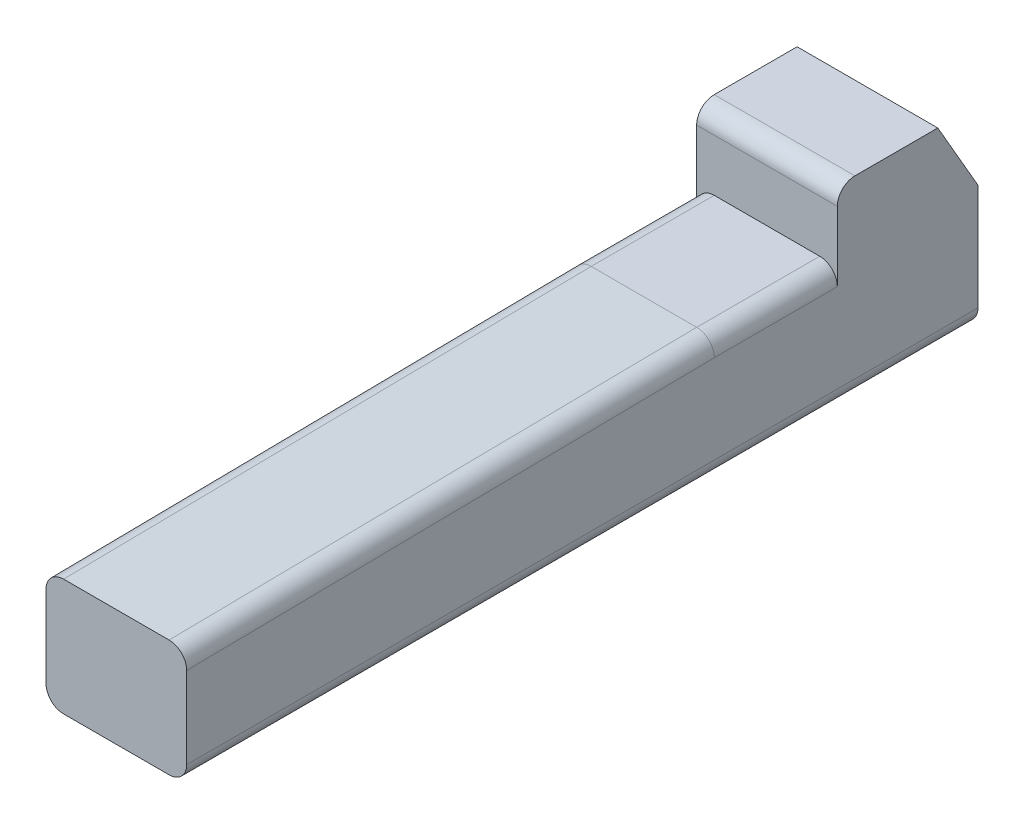
ISO-10303-21;
HEADER;
FILE_DESCRIPTION(('STEP AP214'),'2;1');
FILE_NAME('part.step','',(''),(''),'','','');
FILE_SCHEMA(('AUTOMOTIVE_DESIGN { 1 0 10303 214 1 1 1 1 }'));
ENDSEC;
DATA;
#1=APPLICATION_CONTEXT('core data for automotive mechanical design processes');
#2=APPLICATION_PROTOCOL_DEFINITION('international standard','automotive_design',2000,#1);
#3=PRODUCT_CONTEXT('',#1,'mechanical');
#4=PRODUCT('Part','Part','',(#3));
#5=PRODUCT_RELATED_PRODUCT_CATEGORY('part','',(#4));
#6=PRODUCT_DEFINITION_FORMATION('','',#4);
#7=PRODUCT_DEFINITION_CONTEXT('part definition',#1,'design');
#8=PRODUCT_DEFINITION('design','',#6,#7);
#9=PRODUCT_DEFINITION_SHAPE('','',#8);
#10=(LENGTH_UNIT() NAMED_UNIT(*) SI_UNIT(.MILLI.,.METRE.));
#11=(NAMED_UNIT(*) PLANE_ANGLE_UNIT() SI_UNIT($,.RADIAN.));
#12=(NAMED_UNIT(*) SI_UNIT($,.STERADIAN.) SOLID_ANGLE_UNIT());
#13=UNCERTAINTY_MEASURE_WITH_UNIT(LENGTH_MEASURE(1.E-05),#10,'distance_accuracy_value','');
#14=(GEOMETRIC_REPRESENTATION_CONTEXT(3) GLOBAL_UNCERTAINTY_ASSIGNED_CONTEXT((#13)) GLOBAL_UNIT_ASSIGNED_CONTEXT((#10,
#11,#12)) REPRESENTATION_CONTEXT('',''));
#15=CARTESIAN_POINT('',(0.,0.,0.));
#16=DIRECTION('',(0.,0.,1.));
#17=DIRECTION('',(1.,0.,0.));
#18=AXIS2_PLACEMENT_3D('',#15,#16,#17);
#19=CARTESIAN_POINT('',(4.,-5.5,8.));
#20=DIRECTION('',(-1.,0.,0.));
#21=DIRECTION('',(0.,0.,1.));
#22=AXIS2_PLACEMENT_3D('',#19,#20,#21);
#23=PLANE('',#22);
#24=DIRECTION('',(0.,0.,-1.));
#25=VECTOR('',#24,1.);
#26=CARTESIAN_POINT('',(4.,5.5,8.));
#27=LINE('',#26,#25);
#28=CARTESIAN_POINT('',(4.,5.5,7.));
#29=VERTEX_POINT('',#28);
#30=CARTESIAN_POINT('',(4.,5.5,2.28630706599093));
#31=VERTEX_POINT('',#30);
#32=EDGE_CURVE('E144',#29,#31,#27,.T.);
#33=ORIENTED_EDGE('',*,*,#32,.F.);
#34=CARTESIAN_POINT('',(4.,4.5,7.));
#35=DIRECTION('',(-1.,0.,0.));
#36=DIRECTION('',(0.,0.,1.));
#37=AXIS2_PLACEMENT_3D('',#34,#35,#36);
#38=CIRCLE('',#37,1.);
#39=CARTESIAN_POINT('',(4.,4.5,8.));
#40=VERTEX_POINT('',#39);
#41=EDGE_CURVE('E223',#29,#40,#38,.F.);
#42=ORIENTED_EDGE('',*,*,#41,.T.);
#43=DIRECTION('',(0.,1.,0.));
#44=VECTOR('',#43,1.);
#45=CARTESIAN_POINT('',(4.,-5.5,8.));
#46=LINE('',#45,#44);
#47=CARTESIAN_POINT('',(4.,0.54,8.));
#48=VERTEX_POINT('',#47);
#49=EDGE_CURVE('E192',#48,#40,#46,.T.);
#50=ORIENTED_EDGE('',*,*,#49,.F.);
#51=DIRECTION('',(0.,0.,-1.));
#52=VECTOR('',#51,1.);
#53=CARTESIAN_POINT('',(4.,0.54,15.));
#54=LINE('',#53,#52);
#55=CARTESIAN_POINT('',(4.,0.54,14.9933336296033));
#56=VERTEX_POINT('',#55);
#57=EDGE_CURVE('E219',#48,#56,#54,.F.);
#58=ORIENTED_EDGE('',*,*,#57,.T.);
#59=DIRECTION('',(0.,-0.0133321483061496,0.999911122961207));
#60=VECTOR('',#59,1.);
#61=CARTESIAN_POINT('',(4.,0.632154287632467,8.08176205716843));
#62=LINE('',#61,#60);
#63=CARTESIAN_POINT('',(4.,0.139911115061371,45.));
#64=VERTEX_POINT('',#63);
#65=EDGE_CURVE('E217',#56,#64,#62,.T.);
#66=ORIENTED_EDGE('',*,*,#65,.T.);
#67=DIRECTION('',(0.,-1.,0.));
#68=VECTOR('',#67,1.);
#69=CARTESIAN_POINT('',(4.,-5.50000000000001,45.));
#70=LINE('',#69,#68);
#71=CARTESIAN_POINT('',(4.,-4.5,45.));
#72=VERTEX_POINT('',#71);
#73=EDGE_CURVE('E176',#64,#72,#70,.T.);
#74=ORIENTED_EDGE('',*,*,#73,.T.);
#75=DIRECTION('',(0.,0.,-1.));
#76=VECTOR('',#75,1.);
#77=CARTESIAN_POINT('',(4.,-4.5,8.));
#78=LINE('',#77,#76);
#79=CARTESIAN_POINT('',(4.,-4.5,0.));
#80=VERTEX_POINT('',#79);
#81=EDGE_CURVE('E221',#72,#80,#78,.T.);
#82=ORIENTED_EDGE('',*,*,#81,.T.);
#83=DIRECTION('',(0.,1.,0.));
#84=VECTOR('',#83,1.);
#85=CARTESIAN_POINT('',(4.,-5.5,0.));
#86=LINE('',#85,#84);
#87=CARTESIAN_POINT('',(4.,1.54,0.));
#88=VERTEX_POINT('',#87);
#89=EDGE_CURVE('E170',#80,#88,#86,.T.);
#90=ORIENTED_EDGE('',*,*,#89,.T.);
#91=DIRECTION('',(0.,0.866025403784438,0.500000000000001));
#92=VECTOR('',#91,1.);
#93=CARTESIAN_POINT('',(4.,1.54,0.));
#94=LINE('',#93,#92);
#95=EDGE_CURVE('E161',#88,#31,#94,.T.);
#96=ORIENTED_EDGE('',*,*,#95,.T.);
#97=EDGE_LOOP('',(#33,#42,#50,#58,#66,#74,#82,#90,#96));
#98=FACE_BOUND('',#97,.T.);
#99=ADVANCED_FACE('F39',(#98),#23,.F.);
#100=CARTESIAN_POINT('',(-4.,5.5,8.));
#101=DIRECTION('',(0.,-1.,0.));
#102=DIRECTION('',(0.,0.,-1.));
#103=AXIS2_PLACEMENT_3D('',#100,#101,#102);
#104=PLANE('',#103);
#105=DIRECTION('',(0.,0.,-1.));
#106=VECTOR('',#105,1.);
#107=CARTESIAN_POINT('',(-4.,5.5,8.));
#108=LINE('',#107,#106);
#109=CARTESIAN_POINT('',(-4.,5.5,7.));
#110=VERTEX_POINT('',#109);
#111=CARTESIAN_POINT('',(-4.,5.5,2.28630706599093));
#112=VERTEX_POINT('',#111);
#113=EDGE_CURVE('E155',#110,#112,#108,.T.);
#114=ORIENTED_EDGE('',*,*,#113,.F.);
#115=DIRECTION('',(-1.,0.,0.));
#116=VECTOR('',#115,1.);
#117=CARTESIAN_POINT('',(-4.,5.5,7.));
#118=LINE('',#117,#116);
#119=EDGE_CURVE('E150',#110,#29,#118,.F.);
#120=ORIENTED_EDGE('',*,*,#119,.T.);
#121=ORIENTED_EDGE('',*,*,#32,.T.);
#122=DIRECTION('',(-1.,0.,0.));
#123=VECTOR('',#122,1.);
#124=CARTESIAN_POINT('',(4.,5.5,2.28630706599093));
#125=LINE('',#124,#123);
#126=EDGE_CURVE('E148',#31,#112,#125,.T.);
#127=ORIENTED_EDGE('',*,*,#126,.T.);
#128=EDGE_LOOP('',(#114,#120,#121,#127));
#129=FACE_BOUND('',#128,.T.);
#130=ADVANCED_FACE('F147',(#129),#104,.F.);
#131=CARTESIAN_POINT('',(-4.,-5.5,8.));
#132=DIRECTION('',(1.,0.,0.));
#133=DIRECTION('',(0.,0.,-1.));
#134=AXIS2_PLACEMENT_3D('',#131,#132,#133);
#135=PLANE('',#134);
#136=DIRECTION('',(0.,-1.,0.));
#137=VECTOR('',#136,1.);
#138=CARTESIAN_POINT('',(-4.,-5.5,8.));
#139=LINE('',#138,#137);
#140=CARTESIAN_POINT('',(-4.,4.5,8.));
#141=VERTEX_POINT('',#140);
#142=CARTESIAN_POINT('',(-4.,0.54,8.));
#143=VERTEX_POINT('',#142);
#144=EDGE_CURVE('E195',#141,#143,#139,.T.);
#145=ORIENTED_EDGE('',*,*,#144,.F.);
#146=CARTESIAN_POINT('',(-4.,4.5,7.));
#147=DIRECTION('',(1.,0.,0.));
#148=DIRECTION('',(0.,0.,-1.));
#149=AXIS2_PLACEMENT_3D('',#146,#147,#148);
#150=CIRCLE('',#149,1.);
#151=EDGE_CURVE('E214',#141,#110,#150,.F.);
#152=ORIENTED_EDGE('',*,*,#151,.T.);
#153=ORIENTED_EDGE('',*,*,#113,.T.);
#154=DIRECTION('',(0.,0.866025403784438,0.500000000000001));
#155=VECTOR('',#154,1.);
#156=CARTESIAN_POINT('',(-4.,1.54,0.));
#157=LINE('',#156,#155);
#158=CARTESIAN_POINT('',(-4.,1.54,0.));
#159=VERTEX_POINT('',#158);
#160=EDGE_CURVE('E164',#159,#112,#157,.T.);
#161=ORIENTED_EDGE('',*,*,#160,.F.);
#162=DIRECTION('',(0.,-1.,0.));
#163=VECTOR('',#162,1.);
#164=CARTESIAN_POINT('',(-4.,-5.5,0.));
#165=LINE('',#164,#163);
#166=CARTESIAN_POINT('',(-4.,-4.5,0.));
#167=VERTEX_POINT('',#166);
#168=EDGE_CURVE('E199',#159,#167,#165,.T.);
#169=ORIENTED_EDGE('',*,*,#168,.T.);
#170=DIRECTION('',(0.,0.,-1.));
#171=VECTOR('',#170,1.);
#172=CARTESIAN_POINT('',(-4.,-4.5,8.));
#173=LINE('',#172,#171);
#174=CARTESIAN_POINT('',(-4.,-4.5,45.));
#175=VERTEX_POINT('',#174);
#176=EDGE_CURVE('E212',#167,#175,#173,.F.);
#177=ORIENTED_EDGE('',*,*,#176,.T.);
#178=DIRECTION('',(0.,-1.,0.));
#179=VECTOR('',#178,1.);
#180=CARTESIAN_POINT('',(-4.,-5.50000000000001,45.));
#181=LINE('',#180,#179);
#182=CARTESIAN_POINT('',(-4.,0.139911115061371,45.));
#183=VERTEX_POINT('',#182);
#184=EDGE_CURVE('E165',#183,#175,#181,.T.);
#185=ORIENTED_EDGE('',*,*,#184,.F.);
#186=DIRECTION('',(0.,-0.0133321483061496,0.999911122961207));
#187=VECTOR('',#186,1.);
#188=CARTESIAN_POINT('',(-4.,0.632154287632466,8.08176205716843));
#189=LINE('',#188,#187);
#190=CARTESIAN_POINT('',(-4.,0.54,14.9933336296033));
#191=VERTEX_POINT('',#190);
#192=EDGE_CURVE('E207',#183,#191,#189,.F.);
#193=ORIENTED_EDGE('',*,*,#192,.T.);
#194=DIRECTION('',(0.,0.,-1.));
#195=VECTOR('',#194,1.);
#196=CARTESIAN_POINT('',(-4.,0.54,8.));
#197=LINE('',#196,#195);
#198=EDGE_CURVE('E209',#191,#143,#197,.T.);
#199=ORIENTED_EDGE('',*,*,#198,.T.);
#200=EDGE_LOOP('',(#145,#152,#153,#161,#169,#177,#185,#193,#199));
#201=FACE_BOUND('',#200,.T.);
#202=ADVANCED_FACE('F277',(#201),#135,.F.);
#203=CARTESIAN_POINT('',(-4.,-5.5,8.));
#204=DIRECTION('',(0.,1.,0.));
#205=DIRECTION('',(0.,0.,1.));
#206=AXIS2_PLACEMENT_3D('',#203,#204,#205);
#207=PLANE('',#206);
#208=DIRECTION('',(1.,0.,0.));
#209=VECTOR('',#208,1.);
#210=CARTESIAN_POINT('',(-4.,-5.5,0.));
#211=LINE('',#210,#209);
#212=CARTESIAN_POINT('',(-3.,-5.5,0.));
#213=VERTEX_POINT('',#212);
#214=CARTESIAN_POINT('',(3.,-5.5,0.));
#215=VERTEX_POINT('',#214);
#216=EDGE_CURVE('E196',#213,#215,#211,.T.);
#217=ORIENTED_EDGE('',*,*,#216,.T.);
#218=DIRECTION('',(0.,0.,-1.));
#219=VECTOR('',#218,1.);
#220=CARTESIAN_POINT('',(3.,-5.5,8.));
#221=LINE('',#220,#219);
#222=CARTESIAN_POINT('',(3.,-5.50000000000001,45.));
#223=VERTEX_POINT('',#222);
#224=EDGE_CURVE('E237',#215,#223,#221,.F.);
#225=ORIENTED_EDGE('',*,*,#224,.T.);
#226=DIRECTION('',(-1.,0.,0.));
#227=VECTOR('',#226,1.);
#228=CARTESIAN_POINT('',(4.,-5.50000000000001,45.));
#229=LINE('',#228,#227);
#230=CARTESIAN_POINT('',(-3.,-5.50000000000001,45.));
#231=VERTEX_POINT('',#230);
#232=EDGE_CURVE('E179',#223,#231,#229,.T.);
#233=ORIENTED_EDGE('',*,*,#232,.T.);
#234=DIRECTION('',(0.,0.,-1.));
#235=VECTOR('',#234,1.);
#236=CARTESIAN_POINT('',(-3.,-5.5,8.));
#237=LINE('',#236,#235);
#238=EDGE_CURVE('E234',#231,#213,#237,.T.);
#239=ORIENTED_EDGE('',*,*,#238,.T.);
#240=EDGE_LOOP('',(#217,#225,#233,#239));
#241=FACE_BOUND('',#240,.T.);
#242=ADVANCED_FACE('F297',(#241),#207,.F.);
#243=CARTESIAN_POINT('',(0.,0.,8.));
#244=DIRECTION('',(0.,0.,-1.));
#245=DIRECTION('',(-1.,0.,0.));
#246=AXIS2_PLACEMENT_3D('',#243,#244,#245);
#247=PLANE('',#246);
#248=ORIENTED_EDGE('',*,*,#49,.T.);
#249=DIRECTION('',(-1.,0.,0.));
#250=VECTOR('',#249,1.);
#251=CARTESIAN_POINT('',(0.,4.5,8.));
#252=LINE('',#251,#250);
#253=EDGE_CURVE('E154',#40,#141,#252,.T.);
#254=ORIENTED_EDGE('',*,*,#253,.T.);
#255=ORIENTED_EDGE('',*,*,#144,.T.);
#256=CARTESIAN_POINT('',(-3.,0.54,8.));
#257=DIRECTION('',(0.,0.,-1.));
#258=DIRECTION('',(-1.,0.,0.));
#259=AXIS2_PLACEMENT_3D('',#256,#257,#258);
#260=CIRCLE('',#259,1.);
#261=CARTESIAN_POINT('',(-3.,1.54,8.));
#262=VERTEX_POINT('',#261);
#263=EDGE_CURVE('E48',#143,#262,#260,.T.);
#264=ORIENTED_EDGE('',*,*,#263,.T.);
#265=DIRECTION('',(1.,0.,0.));
#266=VECTOR('',#265,1.);
#267=CARTESIAN_POINT('',(0.,1.54,8.));
#268=LINE('',#267,#266);
#269=CARTESIAN_POINT('',(3.,1.54,8.));
#270=VERTEX_POINT('',#269);
#271=EDGE_CURVE('E186',#262,#270,#268,.T.);
#272=ORIENTED_EDGE('',*,*,#271,.T.);
#273=CARTESIAN_POINT('',(3.,0.54,8.));
#274=DIRECTION('',(0.,0.,-1.));
#275=DIRECTION('',(-1.,0.,0.));
#276=AXIS2_PLACEMENT_3D('',#273,#274,#275);
#277=CIRCLE('',#276,1.);
#278=EDGE_CURVE('E11',#270,#48,#277,.T.);
#279=ORIENTED_EDGE('',*,*,#278,.T.);
#280=EDGE_LOOP('',(#248,#254,#255,#264,#272,#279));
#281=FACE_BOUND('',#280,.T.);
#282=ADVANCED_FACE('F283',(#281),#247,.F.);
#283=CARTESIAN_POINT('',(0.,0.,0.));
#284=DIRECTION('',(0.,0.,-1.));
#285=DIRECTION('',(-1.,0.,0.));
#286=AXIS2_PLACEMENT_3D('',#283,#284,#285);
#287=PLANE('',#286);
#288=ORIENTED_EDGE('',*,*,#89,.F.);
#289=CARTESIAN_POINT('',(3.,-4.5,0.));
#290=DIRECTION('',(0.,0.,-1.));
#291=DIRECTION('',(-1.,0.,0.));
#292=AXIS2_PLACEMENT_3D('',#289,#290,#291);
#293=CIRCLE('',#292,1.);
#294=EDGE_CURVE('E232',#80,#215,#293,.T.);
#295=ORIENTED_EDGE('',*,*,#294,.T.);
#296=ORIENTED_EDGE('',*,*,#216,.F.);
#297=CARTESIAN_POINT('',(-3.,-4.5,0.));
#298=DIRECTION('',(0.,0.,-1.));
#299=DIRECTION('',(-1.,0.,0.));
#300=AXIS2_PLACEMENT_3D('',#297,#298,#299);
#301=CIRCLE('',#300,1.);
#302=EDGE_CURVE('E230',#213,#167,#301,.T.);
#303=ORIENTED_EDGE('',*,*,#302,.T.);
#304=ORIENTED_EDGE('',*,*,#168,.F.);
#305=DIRECTION('',(-1.,0.,0.));
#306=VECTOR('',#305,1.);
#307=CARTESIAN_POINT('',(4.,1.54,0.));
#308=LINE('',#307,#306);
#309=EDGE_CURVE('E166',#88,#159,#308,.T.);
#310=ORIENTED_EDGE('',*,*,#309,.F.);
#311=EDGE_LOOP('',(#288,#295,#296,#303,#304,#310));
#312=FACE_BOUND('',#311,.T.);
#313=ADVANCED_FACE('F272',(#312),#287,.T.);
#314=CARTESIAN_POINT('',(0.,1.54,15.));
#315=DIRECTION('',(0.,1.,0.));
#316=DIRECTION('',(0.,0.,1.));
#317=AXIS2_PLACEMENT_3D('',#314,#315,#316);
#318=PLANE('',#317);
#319=ORIENTED_EDGE('',*,*,#271,.F.);
#320=DIRECTION('',(0.,0.,-1.));
#321=VECTOR('',#320,1.);
#322=CARTESIAN_POINT('',(-3.,1.54,15.));
#323=LINE('',#322,#321);
#324=CARTESIAN_POINT('',(-3.,1.54,15.));
#325=VERTEX_POINT('',#324);
#326=EDGE_CURVE('E228',#262,#325,#323,.F.);
#327=ORIENTED_EDGE('',*,*,#326,.T.);
#328=DIRECTION('',(1.,0.,0.));
#329=VECTOR('',#328,1.);
#330=CARTESIAN_POINT('',(0.,1.54,15.));
#331=LINE('',#330,#329);
#332=CARTESIAN_POINT('',(3.,1.54,15.));
#333=VERTEX_POINT('',#332);
#334=EDGE_CURVE('E187',#325,#333,#331,.T.);
#335=ORIENTED_EDGE('',*,*,#334,.T.);
#336=DIRECTION('',(0.,0.,-1.));
#337=VECTOR('',#336,1.);
#338=CARTESIAN_POINT('',(3.,1.54,8.));
#339=LINE('',#338,#337);
#340=EDGE_CURVE('E225',#333,#270,#339,.T.);
#341=ORIENTED_EDGE('',*,*,#340,.T.);
#342=EDGE_LOOP('',(#319,#327,#335,#341));
#343=FACE_BOUND('',#342,.T.);
#344=ADVANCED_FACE('F286',(#343),#318,.T.);
#345=CARTESIAN_POINT('',(4.,1.14,45.));
#346=DIRECTION('',(0.,-0.999911122961207,-0.0133321483061496));
#347=DIRECTION('',(0.,0.0133321483061496,-0.999911122961207));
#348=AXIS2_PLACEMENT_3D('',#345,#346,#347);
#349=PLANE('',#348);
#350=ORIENTED_EDGE('',*,*,#334,.F.);
#351=DIRECTION('',(0.,-0.0133321483061496,0.999911122961207));
#352=VECTOR('',#351,1.);
#353=CARTESIAN_POINT('',(-3.,1.14,45.));
#354=LINE('',#353,#352);
#355=CARTESIAN_POINT('',(-3.,1.14,45.));
#356=VERTEX_POINT('',#355);
#357=EDGE_CURVE('E56',#325,#356,#354,.T.);
#358=ORIENTED_EDGE('',*,*,#357,.T.);
#359=DIRECTION('',(-1.,0.,0.));
#360=VECTOR('',#359,1.);
#361=CARTESIAN_POINT('',(4.,1.14,45.));
#362=LINE('',#361,#360);
#363=CARTESIAN_POINT('',(3.,1.14,45.));
#364=VERTEX_POINT('',#363);
#365=EDGE_CURVE('E184',#364,#356,#362,.T.);
#366=ORIENTED_EDGE('',*,*,#365,.F.);
#367=DIRECTION('',(0.,-0.0133321483061496,0.999911122961207));
#368=VECTOR('',#367,1.);
#369=CARTESIAN_POINT('',(3.,1.14,45.));
#370=LINE('',#369,#368);
#371=EDGE_CURVE('E246',#364,#333,#370,.F.);
#372=ORIENTED_EDGE('',*,*,#371,.T.);
#373=EDGE_LOOP('',(#350,#358,#366,#372));
#374=FACE_BOUND('',#373,.T.);
#375=ADVANCED_FACE('F287',(#374),#349,.F.);
#376=CARTESIAN_POINT('',(4.,-5.50000000000001,45.));
#377=DIRECTION('',(0.,0.,-1.));
#378=DIRECTION('',(-1.,0.,0.));
#379=AXIS2_PLACEMENT_3D('',#376,#377,#378);
#380=PLANE('',#379);
#381=ORIENTED_EDGE('',*,*,#232,.F.);
#382=CARTESIAN_POINT('',(3.,-4.5,45.));
#383=DIRECTION('',(0.,0.,-1.));
#384=DIRECTION('',(-1.,0.,0.));
#385=AXIS2_PLACEMENT_3D('',#382,#383,#384);
#386=CIRCLE('',#385,1.);
#387=EDGE_CURVE('E244',#223,#72,#386,.F.);
#388=ORIENTED_EDGE('',*,*,#387,.T.);
#389=ORIENTED_EDGE('',*,*,#73,.F.);
#390=CARTESIAN_POINT('',(3.,0.139911115061373,45.));
#391=DIRECTION('',(0.,0.,-1.));
#392=DIRECTION('',(0.,-1.,0.));
#393=AXIS2_PLACEMENT_3D('',#390,#391,#392);
#394=ELLIPSE('',#393,1.00008888493862,1.);
#395=EDGE_CURVE('E63',#64,#364,#394,.F.);
#396=ORIENTED_EDGE('',*,*,#395,.T.);
#397=ORIENTED_EDGE('',*,*,#365,.T.);
#398=CARTESIAN_POINT('',(-3.,0.139911115061372,45.));
#399=DIRECTION('',(0.,0.,-1.));
#400=DIRECTION('',(0.,-1.,0.));
#401=AXIS2_PLACEMENT_3D('',#398,#399,#400);
#402=ELLIPSE('',#401,1.00008888493862,1.);
#403=EDGE_CURVE('E240',#356,#183,#402,.F.);
#404=ORIENTED_EDGE('',*,*,#403,.T.);
#405=ORIENTED_EDGE('',*,*,#184,.T.);
#406=CARTESIAN_POINT('',(-3.,-4.5,45.));
#407=DIRECTION('',(0.,0.,-1.));
#408=DIRECTION('',(-1.,0.,0.));
#409=AXIS2_PLACEMENT_3D('',#406,#407,#408);
#410=CIRCLE('',#409,1.);
#411=EDGE_CURVE('E242',#175,#231,#410,.F.);
#412=ORIENTED_EDGE('',*,*,#411,.T.);
#413=EDGE_LOOP('',(#381,#388,#389,#396,#397,#404,#405,#412));
#414=FACE_BOUND('',#413,.T.);
#415=ADVANCED_FACE('F266',(#414),#380,.F.);
#416=CARTESIAN_POINT('',(4.,1.54,0.));
#417=DIRECTION('',(0.,-0.500000000000001,0.866025403784438));
#418=DIRECTION('',(0.,-0.866025403784438,-0.500000000000001));
#419=AXIS2_PLACEMENT_3D('',#416,#417,#418);
#420=PLANE('',#419);
#421=ORIENTED_EDGE('',*,*,#160,.T.);
#422=ORIENTED_EDGE('',*,*,#126,.F.);
#423=ORIENTED_EDGE('',*,*,#95,.F.);
#424=ORIENTED_EDGE('',*,*,#309,.T.);
#425=EDGE_LOOP('',(#421,#422,#423,#424));
#426=FACE_BOUND('',#425,.T.);
#427=ADVANCED_FACE('F160',(#426),#420,.F.);
#428=CARTESIAN_POINT('',(0.,4.5,7.));
#429=DIRECTION('',(-1.,0.,0.));
#430=DIRECTION('',(0.,0.,1.));
#431=AXIS2_PLACEMENT_3D('',#428,#429,#430);
#432=CYLINDRICAL_SURFACE('',#431,1.);
#433=ORIENTED_EDGE('',*,*,#41,.F.);
#434=ORIENTED_EDGE('',*,*,#119,.F.);
#435=ORIENTED_EDGE('',*,*,#151,.F.);
#436=ORIENTED_EDGE('',*,*,#253,.F.);
#437=EDGE_LOOP('',(#433,#434,#435,#436));
#438=FACE_BOUND('',#437,.T.);
#439=ADVANCED_FACE('F280',(#438),#432,.T.);
#440=CARTESIAN_POINT('',(-3.,0.140088877038788,44.9866678516938));
#441=DIRECTION('',(0.,-0.0133321483061496,0.999911122961207));
#442=DIRECTION('',(0.,-0.999911122961207,-0.0133321483061496));
#443=AXIS2_PLACEMENT_3D('',#440,#441,#442);
#444=CYLINDRICAL_SURFACE('',#443,1.);
#445=ORIENTED_EDGE('',*,*,#403,.F.);
#446=ORIENTED_EDGE('',*,*,#357,.F.);
#447=CARTESIAN_POINT('',(-3.,0.539999999999905,14.9933336296175));
#448=DIRECTION('',(0.,-0.00666622227324427,0.999977780493449));
#449=DIRECTION('',(0.,-0.999977780493449,-0.00666622227324213));
#450=AXIS2_PLACEMENT_3D('',#447,#448,#449);
#451=ELLIPSE('',#450,1.00002222000027,1.);
#452=EDGE_CURVE('E173',#191,#325,#451,.F.);
#453=ORIENTED_EDGE('',*,*,#452,.F.);
#454=ORIENTED_EDGE('',*,*,#192,.F.);
#455=EDGE_LOOP('',(#445,#446,#453,#454));
#456=FACE_BOUND('',#455,.T.);
#457=ADVANCED_FACE('F290',(#456),#444,.T.);
#458=CARTESIAN_POINT('',(-3.,0.54,8.));
#459=DIRECTION('',(0.,0.,1.));
#460=DIRECTION('',(1.,0.,0.));
#461=AXIS2_PLACEMENT_3D('',#458,#459,#460);
#462=CYLINDRICAL_SURFACE('',#461,1.);
#463=ORIENTED_EDGE('',*,*,#452,.T.);
#464=ORIENTED_EDGE('',*,*,#326,.F.);
#465=ORIENTED_EDGE('',*,*,#263,.F.);
#466=ORIENTED_EDGE('',*,*,#198,.F.);
#467=EDGE_LOOP('',(#463,#464,#465,#466));
#468=FACE_BOUND('',#467,.T.);
#469=ADVANCED_FACE('F316',(#468),#462,.T.);
#470=CARTESIAN_POINT('',(3.,0.632154287632466,8.08176205716843));
#471=DIRECTION('',(0.,-0.0133321483061496,0.999911122961207));
#472=DIRECTION('',(0.,-0.999911122961207,-0.0133321483061496));
#473=AXIS2_PLACEMENT_3D('',#470,#471,#472);
#474=CYLINDRICAL_SURFACE('',#473,1.);
#475=ORIENTED_EDGE('',*,*,#395,.F.);
#476=ORIENTED_EDGE('',*,*,#65,.F.);
#477=CARTESIAN_POINT('',(3.,0.540000000000001,14.9933336296031));
#478=DIRECTION('',(0.,-0.00666622227324427,0.999977780493449));
#479=DIRECTION('',(0.,-0.999977780493449,-0.00666622227324213));
#480=AXIS2_PLACEMENT_3D('',#477,#478,#479);
#481=ELLIPSE('',#480,1.00002222000027,1.);
#482=EDGE_CURVE('E43',#333,#56,#481,.F.);
#483=ORIENTED_EDGE('',*,*,#482,.F.);
#484=ORIENTED_EDGE('',*,*,#371,.F.);
#485=EDGE_LOOP('',(#475,#476,#483,#484));
#486=FACE_BOUND('',#485,.T.);
#487=ADVANCED_FACE('F263',(#486),#474,.T.);
#488=CARTESIAN_POINT('',(3.,0.54,15.));
#489=DIRECTION('',(0.,0.,1.));
#490=DIRECTION('',(1.,0.,0.));
#491=AXIS2_PLACEMENT_3D('',#488,#489,#490);
#492=CYLINDRICAL_SURFACE('',#491,1.);
#493=ORIENTED_EDGE('',*,*,#482,.T.);
#494=ORIENTED_EDGE('',*,*,#57,.F.);
#495=ORIENTED_EDGE('',*,*,#278,.F.);
#496=ORIENTED_EDGE('',*,*,#340,.F.);
#497=EDGE_LOOP('',(#493,#494,#495,#496));
#498=FACE_BOUND('',#497,.T.);
#499=ADVANCED_FACE('F259',(#498),#492,.T.);
#500=CARTESIAN_POINT('',(3.,-4.5,8.));
#501=DIRECTION('',(0.,0.,-1.));
#502=DIRECTION('',(-1.,0.,0.));
#503=AXIS2_PLACEMENT_3D('',#500,#501,#502);
#504=CYLINDRICAL_SURFACE('',#503,1.);
#505=ORIENTED_EDGE('',*,*,#387,.F.);
#506=ORIENTED_EDGE('',*,*,#224,.F.);
#507=ORIENTED_EDGE('',*,*,#294,.F.);
#508=ORIENTED_EDGE('',*,*,#81,.F.);
#509=EDGE_LOOP('',(#505,#506,#507,#508));
#510=FACE_BOUND('',#509,.T.);
#511=ADVANCED_FACE('F270',(#510),#504,.T.);
#512=CARTESIAN_POINT('',(-3.,-4.5,8.));
#513=DIRECTION('',(0.,0.,-1.));
#514=DIRECTION('',(-1.,0.,0.));
#515=AXIS2_PLACEMENT_3D('',#512,#513,#514);
#516=CYLINDRICAL_SURFACE('',#515,1.);
#517=ORIENTED_EDGE('',*,*,#411,.F.);
#518=ORIENTED_EDGE('',*,*,#176,.F.);
#519=ORIENTED_EDGE('',*,*,#302,.F.);
#520=ORIENTED_EDGE('',*,*,#238,.F.);
#521=EDGE_LOOP('',(#517,#518,#519,#520));
#522=FACE_BOUND('',#521,.T.);
#523=ADVANCED_FACE('F41',(#522),#516,.T.);
#524=CLOSED_SHELL('',(#99,#130,#202,#242,#282,#313,#344,#375,#415,#427,#439,#457,#469,#487,#499,
#511,#523));
#525=MANIFOLD_SOLID_BREP('B2',#524);
#526=ADVANCED_BREP_SHAPE_REPRESENTATION('',(#18,#525),#14);
#527=SHAPE_DEFINITION_REPRESENTATION(#9,#526);
ENDSEC;
END-ISO-10303-21;
